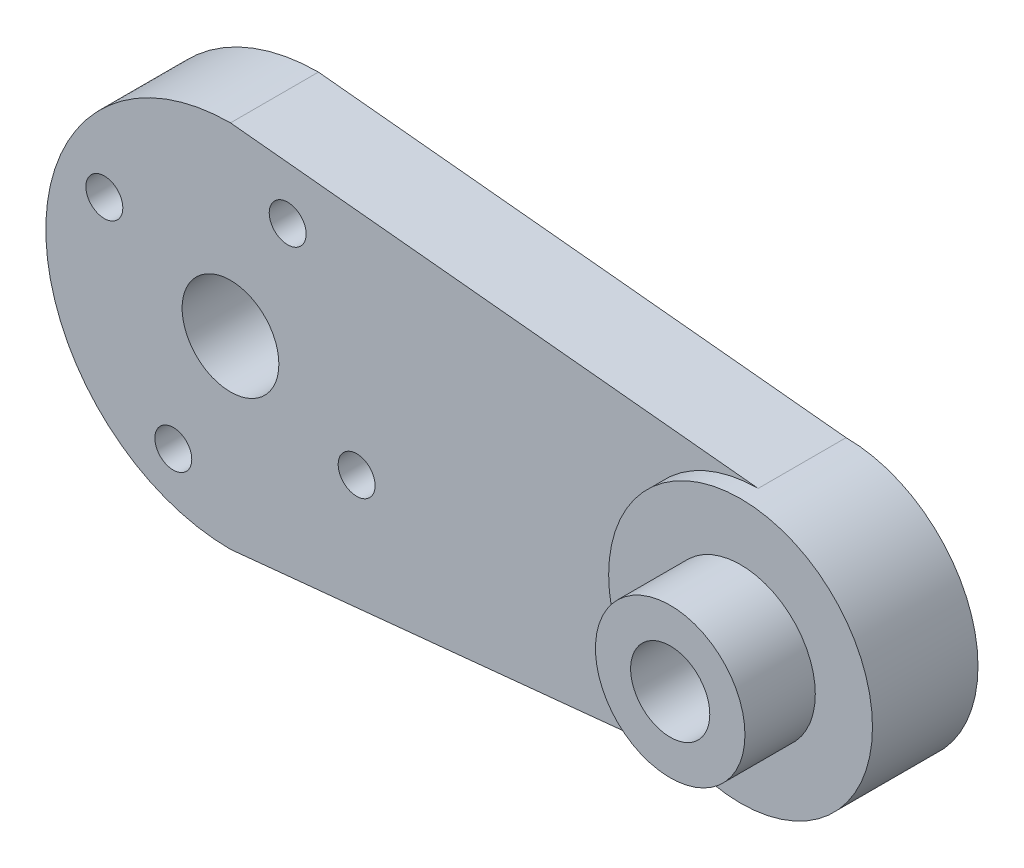
ISO-10303-21;
HEADER;
FILE_DESCRIPTION(('STEP AP214'),'2;1');
FILE_NAME('part.step','',(''),(''),'','','');
FILE_SCHEMA(('AUTOMOTIVE_DESIGN { 1 0 10303 214 1 1 1 1 }'));
ENDSEC;
DATA;
#1=APPLICATION_CONTEXT('core data for automotive mechanical design processes');
#2=APPLICATION_PROTOCOL_DEFINITION('international standard','automotive_design',2000,#1);
#3=PRODUCT_CONTEXT('',#1,'mechanical');
#4=PRODUCT('Part','Part','',(#3));
#5=PRODUCT_RELATED_PRODUCT_CATEGORY('part','',(#4));
#6=PRODUCT_DEFINITION_FORMATION('','',#4);
#7=PRODUCT_DEFINITION_CONTEXT('part definition',#1,'design');
#8=PRODUCT_DEFINITION('design','',#6,#7);
#9=PRODUCT_DEFINITION_SHAPE('','',#8);
#10=(LENGTH_UNIT() NAMED_UNIT(*) SI_UNIT(.MILLI.,.METRE.));
#11=(NAMED_UNIT(*) PLANE_ANGLE_UNIT() SI_UNIT($,.RADIAN.));
#12=(NAMED_UNIT(*) SI_UNIT($,.STERADIAN.) SOLID_ANGLE_UNIT());
#13=UNCERTAINTY_MEASURE_WITH_UNIT(LENGTH_MEASURE(1.E-05),#10,'distance_accuracy_value','');
#14=(GEOMETRIC_REPRESENTATION_CONTEXT(3) GLOBAL_UNCERTAINTY_ASSIGNED_CONTEXT((#13)) GLOBAL_UNIT_ASSIGNED_CONTEXT((#10,
#11,#12)) REPRESENTATION_CONTEXT('',''));
#15=CARTESIAN_POINT('',(0.,0.,0.));
#16=DIRECTION('',(0.,0.,1.));
#17=DIRECTION('',(1.,0.,0.));
#18=AXIS2_PLACEMENT_3D('',#15,#16,#17);
#19=CARTESIAN_POINT('',(0.,0.,5.));
#20=DIRECTION('',(0.,0.,1.));
#21=DIRECTION('',(1.,0.,0.));
#22=AXIS2_PLACEMENT_3D('',#19,#20,#21);
#23=PLANE('',#22);
#24=CARTESIAN_POINT('',(0.,0.,5.));
#25=DIRECTION('',(0.,0.,1.));
#26=DIRECTION('',(1.,0.,0.));
#27=AXIS2_PLACEMENT_3D('',#24,#25,#26);
#28=CIRCLE('',#27,2.75);
#29=CARTESIAN_POINT('',(2.75,0.,5.));
#30=VERTEX_POINT('',#29);
#31=EDGE_CURVE('E133',#30,#30,#28,.T.);
#32=ORIENTED_EDGE('',*,*,#31,.F.);
#33=EDGE_LOOP('',(#32));
#34=FACE_BOUND('',#33,.T.);
#35=CARTESIAN_POINT('',(3.25175455457334,7.17229177320174,5.));
#36=DIRECTION('',(0.,0.,1.));
#37=DIRECTION('',(1.,0.,0.));
#38=AXIS2_PLACEMENT_3D('',#35,#36,#37);
#39=CIRCLE('',#38,1.05);
#40=CARTESIAN_POINT('',(4.30175455457334,7.17229177320174,5.));
#41=VERTEX_POINT('',#40);
#42=EDGE_CURVE('E120',#41,#41,#39,.T.);
#43=ORIENTED_EDGE('',*,*,#42,.F.);
#44=EDGE_LOOP('',(#43));
#45=FACE_BOUND('',#44,.T.);
#46=CARTESIAN_POINT('',(-7.17229177428383,3.25175455441882,5.));
#47=DIRECTION('',(0.,0.,1.));
#48=DIRECTION('',(1.,0.,0.));
#49=AXIS2_PLACEMENT_3D('',#46,#47,#48);
#50=CIRCLE('',#49,1.05);
#51=CARTESIAN_POINT('',(-6.12229177428383,3.25175455441882,5.));
#52=VERTEX_POINT('',#51);
#53=EDGE_CURVE('E114',#52,#52,#50,.T.);
#54=ORIENTED_EDGE('',*,*,#53,.F.);
#55=EDGE_LOOP('',(#54));
#56=FACE_BOUND('',#55,.T.);
#57=CARTESIAN_POINT('',(-3.25175455550097,-7.17229177443826,5.));
#58=DIRECTION('',(0.,0.,1.));
#59=DIRECTION('',(1.,0.,0.));
#60=AXIS2_PLACEMENT_3D('',#57,#58,#59);
#61=CIRCLE('',#60,1.05);
#62=CARTESIAN_POINT('',(-2.20175455550097,-7.17229177443826,5.));
#63=VERTEX_POINT('',#62);
#64=EDGE_CURVE('E108',#63,#63,#61,.T.);
#65=ORIENTED_EDGE('',*,*,#64,.F.);
#66=EDGE_LOOP('',(#65));
#67=FACE_BOUND('',#66,.T.);
#68=CARTESIAN_POINT('',(7.17229177335619,-3.25175455565539,5.));
#69=DIRECTION('',(0.,0.,1.));
#70=DIRECTION('',(1.,0.,0.));
#71=AXIS2_PLACEMENT_3D('',#68,#69,#70);
#72=CIRCLE('',#71,1.05);
#73=CARTESIAN_POINT('',(8.22229177335619,-3.25175455565539,5.));
#74=VERTEX_POINT('',#73);
#75=EDGE_CURVE('E102',#74,#74,#72,.T.);
#76=ORIENTED_EDGE('',*,*,#75,.F.);
#77=EDGE_LOOP('',(#76));
#78=FACE_BOUND('',#77,.T.);
#79=DIRECTION('',(0.995037190209989,0.099503719020999,0.));
#80=VECTOR('',#79,1.);
#81=CARTESIAN_POINT('',(30.,-7.5,5.));
#82=LINE('',#81,#80);
#83=CARTESIAN_POINT('',(0.,-10.5,5.));
#84=VERTEX_POINT('',#83);
#85=CARTESIAN_POINT('',(30.,-7.5,5.));
#86=VERTEX_POINT('',#85);
#87=EDGE_CURVE('E79',#84,#86,#82,.T.);
#88=ORIENTED_EDGE('',*,*,#87,.T.);
#89=CARTESIAN_POINT('',(30.0000000001623,3.1863400806742E-11,5.));
#90=DIRECTION('',(0.,0.,1.));
#91=DIRECTION('',(1.,0.,0.));
#92=AXIS2_PLACEMENT_3D('',#89,#90,#91);
#93=CIRCLE('',#92,7.49999999983578);
#94=CARTESIAN_POINT('',(30.,7.49999999986765,5.));
#95=VERTEX_POINT('',#94);
#96=EDGE_CURVE('E89',#95,#86,#93,.T.);
#97=ORIENTED_EDGE('',*,*,#96,.F.);
#98=DIRECTION('',(-0.995037190209989,0.099503719020999,0.));
#99=VECTOR('',#98,1.);
#100=CARTESIAN_POINT('',(0.,10.5,5.));
#101=LINE('',#100,#99);
#102=CARTESIAN_POINT('',(0.,10.5,5.));
#103=VERTEX_POINT('',#102);
#104=EDGE_CURVE('E50',#95,#103,#101,.T.);
#105=ORIENTED_EDGE('',*,*,#104,.T.);
#106=CARTESIAN_POINT('',(0.,0.,5.));
#107=DIRECTION('',(0.,0.,1.));
#108=DIRECTION('',(1.,0.,0.));
#109=AXIS2_PLACEMENT_3D('',#106,#107,#108);
#110=CIRCLE('',#109,10.5);
#111=EDGE_CURVE('E139',#103,#84,#110,.T.);
#112=ORIENTED_EDGE('',*,*,#111,.T.);
#113=EDGE_LOOP('',(#88,#97,#105,#112));
#114=FACE_BOUND('',#113,.T.);
#115=ADVANCED_FACE('F33',(#34,#45,#56,#67,#78,#114),#23,.T.);
#116=CARTESIAN_POINT('',(0.,0.,0.));
#117=DIRECTION('',(0.,0.,1.));
#118=DIRECTION('',(1.,0.,0.));
#119=AXIS2_PLACEMENT_3D('',#116,#117,#118);
#120=PLANE('',#119);
#121=CARTESIAN_POINT('',(30.,0.,0.));
#122=DIRECTION('',(0.,0.,1.));
#123=DIRECTION('',(1.,0.,0.));
#124=AXIS2_PLACEMENT_3D('',#121,#122,#123);
#125=CIRCLE('',#124,2.25);
#126=CARTESIAN_POINT('',(32.25,0.,0.));
#127=VERTEX_POINT('',#126);
#128=EDGE_CURVE('E126',#127,#127,#125,.T.);
#129=ORIENTED_EDGE('',*,*,#128,.T.);
#130=EDGE_LOOP('',(#129));
#131=FACE_BOUND('',#130,.T.);
#132=CARTESIAN_POINT('',(0.,0.,0.));
#133=DIRECTION('',(0.,0.,1.));
#134=DIRECTION('',(1.,0.,0.));
#135=AXIS2_PLACEMENT_3D('',#132,#133,#134);
#136=CIRCLE('',#135,10.5);
#137=CARTESIAN_POINT('',(0.,10.5,0.));
#138=VERTEX_POINT('',#137);
#139=CARTESIAN_POINT('',(0.,-10.5,0.));
#140=VERTEX_POINT('',#139);
#141=EDGE_CURVE('E136',#138,#140,#136,.T.);
#142=ORIENTED_EDGE('',*,*,#141,.F.);
#143=DIRECTION('',(-0.995037190209989,0.099503719020999,0.));
#144=VECTOR('',#143,1.);
#145=CARTESIAN_POINT('',(0.,10.5,0.));
#146=LINE('',#145,#144);
#147=CARTESIAN_POINT('',(30.,7.5,0.));
#148=VERTEX_POINT('',#147);
#149=EDGE_CURVE('E74',#148,#138,#146,.T.);
#150=ORIENTED_EDGE('',*,*,#149,.F.);
#151=CARTESIAN_POINT('',(30.,0.,0.));
#152=DIRECTION('',(0.,0.,1.));
#153=DIRECTION('',(1.,0.,0.));
#154=AXIS2_PLACEMENT_3D('',#151,#152,#153);
#155=CIRCLE('',#154,7.5);
#156=CARTESIAN_POINT('',(30.,-7.5,0.));
#157=VERTEX_POINT('',#156);
#158=EDGE_CURVE('E69',#157,#148,#155,.T.);
#159=ORIENTED_EDGE('',*,*,#158,.F.);
#160=DIRECTION('',(0.995037190209989,0.099503719020999,0.));
#161=VECTOR('',#160,1.);
#162=CARTESIAN_POINT('',(30.,-7.5,0.));
#163=LINE('',#162,#161);
#164=EDGE_CURVE('E144',#140,#157,#163,.T.);
#165=ORIENTED_EDGE('',*,*,#164,.F.);
#166=EDGE_LOOP('',(#142,#150,#159,#165));
#167=FACE_BOUND('',#166,.T.);
#168=CARTESIAN_POINT('',(0.,0.,0.));
#169=DIRECTION('',(0.,0.,1.));
#170=DIRECTION('',(1.,0.,0.));
#171=AXIS2_PLACEMENT_3D('',#168,#169,#170);
#172=CIRCLE('',#171,2.75);
#173=CARTESIAN_POINT('',(2.75,0.,0.));
#174=VERTEX_POINT('',#173);
#175=EDGE_CURVE('E132',#174,#174,#172,.T.);
#176=ORIENTED_EDGE('',*,*,#175,.T.);
#177=EDGE_LOOP('',(#176));
#178=FACE_BOUND('',#177,.T.);
#179=CARTESIAN_POINT('',(3.25175455457334,7.17229177320174,0.));
#180=DIRECTION('',(0.,0.,-1.));
#181=DIRECTION('',(-1.,0.,0.));
#182=AXIS2_PLACEMENT_3D('',#179,#180,#181);
#183=CIRCLE('',#182,1.05);
#184=CARTESIAN_POINT('',(2.20175455457334,7.17229177320174,0.));
#185=VERTEX_POINT('',#184);
#186=EDGE_CURVE('E117',#185,#185,#183,.T.);
#187=ORIENTED_EDGE('',*,*,#186,.F.);
#188=EDGE_LOOP('',(#187));
#189=FACE_BOUND('',#188,.T.);
#190=CARTESIAN_POINT('',(-7.17229177428383,3.25175455441882,0.));
#191=DIRECTION('',(0.,0.,-1.));
#192=DIRECTION('',(-1.,0.,0.));
#193=AXIS2_PLACEMENT_3D('',#190,#191,#192);
#194=CIRCLE('',#193,1.05);
#195=CARTESIAN_POINT('',(-8.22229177428383,3.25175455441882,0.));
#196=VERTEX_POINT('',#195);
#197=EDGE_CURVE('E111',#196,#196,#194,.T.);
#198=ORIENTED_EDGE('',*,*,#197,.F.);
#199=EDGE_LOOP('',(#198));
#200=FACE_BOUND('',#199,.T.);
#201=CARTESIAN_POINT('',(-3.25175455550097,-7.17229177443826,0.));
#202=DIRECTION('',(0.,0.,-1.));
#203=DIRECTION('',(-1.,0.,0.));
#204=AXIS2_PLACEMENT_3D('',#201,#202,#203);
#205=CIRCLE('',#204,1.05);
#206=CARTESIAN_POINT('',(-4.30175455550097,-7.17229177443826,0.));
#207=VERTEX_POINT('',#206);
#208=EDGE_CURVE('E105',#207,#207,#205,.T.);
#209=ORIENTED_EDGE('',*,*,#208,.F.);
#210=EDGE_LOOP('',(#209));
#211=FACE_BOUND('',#210,.T.);
#212=CARTESIAN_POINT('',(7.17229177335619,-3.25175455565539,0.));
#213=DIRECTION('',(0.,0.,-1.));
#214=DIRECTION('',(-1.,0.,0.));
#215=AXIS2_PLACEMENT_3D('',#212,#213,#214);
#216=CIRCLE('',#215,1.05);
#217=CARTESIAN_POINT('',(6.12229177335619,-3.25175455565539,0.));
#218=VERTEX_POINT('',#217);
#219=EDGE_CURVE('E99',#218,#218,#216,.T.);
#220=ORIENTED_EDGE('',*,*,#219,.F.);
#221=EDGE_LOOP('',(#220));
#222=FACE_BOUND('',#221,.T.);
#223=ADVANCED_FACE('F150',(#131,#167,#178,#189,#200,#211,#222),#120,.F.);
#224=CARTESIAN_POINT('',(0.,0.,5.));
#225=DIRECTION('',(0.,0.,-1.));
#226=DIRECTION('',(-1.,0.,0.));
#227=AXIS2_PLACEMENT_3D('',#224,#225,#226);
#228=CYLINDRICAL_SURFACE('',#227,10.5);
#229=ORIENTED_EDGE('',*,*,#141,.T.);
#230=DIRECTION('',(0.,0.,-1.));
#231=VECTOR('',#230,1.);
#232=CARTESIAN_POINT('',(0.,-10.5,5.));
#233=LINE('',#232,#231);
#234=EDGE_CURVE('E11',#84,#140,#233,.T.);
#235=ORIENTED_EDGE('',*,*,#234,.F.);
#236=ORIENTED_EDGE('',*,*,#111,.F.);
#237=DIRECTION('',(0.,0.,-1.));
#238=VECTOR('',#237,1.);
#239=CARTESIAN_POINT('',(0.,10.5,5.));
#240=LINE('',#239,#238);
#241=EDGE_CURVE('E83',#103,#138,#240,.T.);
#242=ORIENTED_EDGE('',*,*,#241,.T.);
#243=EDGE_LOOP('',(#229,#235,#236,#242));
#244=FACE_BOUND('',#243,.T.);
#245=ADVANCED_FACE('F35',(#244),#228,.T.);
#246=CARTESIAN_POINT('',(30.,-7.5,5.));
#247=DIRECTION('',(-0.099503719020999,0.995037190209989,0.));
#248=DIRECTION('',(-0.995037190209989,-0.099503719020999,0.));
#249=AXIS2_PLACEMENT_3D('',#246,#247,#248);
#250=PLANE('',#249);
#251=ORIENTED_EDGE('',*,*,#164,.T.);
#252=DIRECTION('',(0.,0.,-1.));
#253=VECTOR('',#252,1.);
#254=CARTESIAN_POINT('',(30.,-7.5,5.));
#255=LINE('',#254,#253);
#256=EDGE_CURVE('E42',#86,#157,#255,.T.);
#257=ORIENTED_EDGE('',*,*,#256,.F.);
#258=ORIENTED_EDGE('',*,*,#87,.F.);
#259=ORIENTED_EDGE('',*,*,#234,.T.);
#260=EDGE_LOOP('',(#251,#257,#258,#259));
#261=FACE_BOUND('',#260,.T.);
#262=ADVANCED_FACE('F154',(#261),#250,.F.);
#263=CARTESIAN_POINT('',(30.,0.,5.));
#264=DIRECTION('',(0.,0.,-1.));
#265=DIRECTION('',(-1.,0.,0.));
#266=AXIS2_PLACEMENT_3D('',#263,#264,#265);
#267=CYLINDRICAL_SURFACE('',#266,7.5);
#268=ORIENTED_EDGE('',*,*,#158,.T.);
#269=DIRECTION('',(0.,0.,-1.));
#270=VECTOR('',#269,1.);
#271=CARTESIAN_POINT('',(30.,7.5,5.));
#272=LINE('',#271,#270);
#273=EDGE_CURVE('E82',#95,#148,#272,.T.);
#274=ORIENTED_EDGE('',*,*,#273,.F.);
#275=ORIENTED_EDGE('',*,*,#96,.T.);
#276=ORIENTED_EDGE('',*,*,#256,.T.);
#277=EDGE_LOOP('',(#268,#274,#275,#276));
#278=FACE_BOUND('',#277,.T.);
#279=CARTESIAN_POINT('',(30.0000000001623,3.1863400806742E-11,6.));
#280=DIRECTION('',(0.,0.,1.));
#281=DIRECTION('',(1.,0.,0.));
#282=AXIS2_PLACEMENT_3D('',#279,#280,#281);
#283=CIRCLE('',#282,7.49999999983578);
#284=CARTESIAN_POINT('',(37.4999999999981,3.1863400806742E-11,6.));
#285=VERTEX_POINT('',#284);
#286=EDGE_CURVE('E91',#285,#285,#283,.T.);
#287=ORIENTED_EDGE('',*,*,#286,.F.);
#288=EDGE_LOOP('',(#287));
#289=FACE_BOUND('',#288,.T.);
#290=ADVANCED_FACE('F87',(#278,#289),#267,.T.);
#291=CARTESIAN_POINT('',(0.,10.5,5.));
#292=DIRECTION('',(-0.099503719020999,-0.995037190209989,0.));
#293=DIRECTION('',(0.995037190209989,-0.099503719020999,0.));
#294=AXIS2_PLACEMENT_3D('',#291,#292,#293);
#295=PLANE('',#294);
#296=ORIENTED_EDGE('',*,*,#149,.T.);
#297=ORIENTED_EDGE('',*,*,#241,.F.);
#298=ORIENTED_EDGE('',*,*,#104,.F.);
#299=ORIENTED_EDGE('',*,*,#273,.T.);
#300=EDGE_LOOP('',(#296,#297,#298,#299));
#301=FACE_BOUND('',#300,.T.);
#302=ADVANCED_FACE('F81',(#301),#295,.F.);
#303=CARTESIAN_POINT('',(0.,0.,5.));
#304=DIRECTION('',(0.,0.,-1.));
#305=DIRECTION('',(-1.,0.,0.));
#306=AXIS2_PLACEMENT_3D('',#303,#304,#305);
#307=CYLINDRICAL_SURFACE('',#306,2.75);
#308=ORIENTED_EDGE('',*,*,#31,.T.);
#309=EDGE_LOOP('',(#308));
#310=FACE_BOUND('',#309,.T.);
#311=ORIENTED_EDGE('',*,*,#175,.F.);
#312=EDGE_LOOP('',(#311));
#313=FACE_BOUND('',#312,.T.);
#314=ADVANCED_FACE('F172',(#310,#313),#307,.F.);
#315=CARTESIAN_POINT('',(30.,0.,10.));
#316=DIRECTION('',(0.,0.,-1.));
#317=DIRECTION('',(-1.,0.,0.));
#318=AXIS2_PLACEMENT_3D('',#315,#316,#317);
#319=CYLINDRICAL_SURFACE('',#318,4.25000000000001);
#320=CARTESIAN_POINT('',(30.,0.,6.));
#321=DIRECTION('',(0.,0.,1.));
#322=DIRECTION('',(1.,0.,0.));
#323=AXIS2_PLACEMENT_3D('',#320,#321,#322);
#324=CIRCLE('',#323,4.25000000000001);
#325=CARTESIAN_POINT('',(34.25,0.,6.));
#326=VERTEX_POINT('',#325);
#327=EDGE_CURVE('E94',#326,#326,#324,.T.);
#328=ORIENTED_EDGE('',*,*,#327,.T.);
#329=EDGE_LOOP('',(#328));
#330=FACE_BOUND('',#329,.T.);
#331=CARTESIAN_POINT('',(30.,0.,10.));
#332=DIRECTION('',(0.,0.,1.));
#333=DIRECTION('',(1.,0.,0.));
#334=AXIS2_PLACEMENT_3D('',#331,#332,#333);
#335=CIRCLE('',#334,4.25000000000001);
#336=CARTESIAN_POINT('',(34.25,0.,10.));
#337=VERTEX_POINT('',#336);
#338=EDGE_CURVE('E129',#337,#337,#335,.T.);
#339=ORIENTED_EDGE('',*,*,#338,.F.);
#340=EDGE_LOOP('',(#339));
#341=FACE_BOUND('',#340,.T.);
#342=ADVANCED_FACE('F179',(#330,#341),#319,.T.);
#343=CARTESIAN_POINT('',(30.,0.,10.));
#344=DIRECTION('',(0.,0.,1.));
#345=DIRECTION('',(1.,0.,0.));
#346=AXIS2_PLACEMENT_3D('',#343,#344,#345);
#347=PLANE('',#346);
#348=CARTESIAN_POINT('',(30.,0.,10.));
#349=DIRECTION('',(0.,0.,1.));
#350=DIRECTION('',(1.,0.,0.));
#351=AXIS2_PLACEMENT_3D('',#348,#349,#350);
#352=CIRCLE('',#351,2.25);
#353=CARTESIAN_POINT('',(32.25,0.,10.));
#354=VERTEX_POINT('',#353);
#355=EDGE_CURVE('E123',#354,#354,#352,.T.);
#356=ORIENTED_EDGE('',*,*,#355,.F.);
#357=EDGE_LOOP('',(#356));
#358=FACE_BOUND('',#357,.T.);
#359=ORIENTED_EDGE('',*,*,#338,.T.);
#360=EDGE_LOOP('',(#359));
#361=FACE_BOUND('',#360,.T.);
#362=ADVANCED_FACE('F184',(#358,#361),#347,.T.);
#363=CARTESIAN_POINT('',(30.,0.,-30.));
#364=DIRECTION('',(0.,0.,1.));
#365=DIRECTION('',(1.,0.,0.));
#366=AXIS2_PLACEMENT_3D('',#363,#364,#365);
#367=CYLINDRICAL_SURFACE('',#366,2.25);
#368=ORIENTED_EDGE('',*,*,#355,.T.);
#369=EDGE_LOOP('',(#368));
#370=FACE_BOUND('',#369,.T.);
#371=ORIENTED_EDGE('',*,*,#128,.F.);
#372=EDGE_LOOP('',(#371));
#373=FACE_BOUND('',#372,.T.);
#374=ADVANCED_FACE('F221',(#370,#373),#367,.F.);
#375=CARTESIAN_POINT('',(3.25175455457334,7.17229177320174,0.));
#376=DIRECTION('',(0.,0.,-1.));
#377=DIRECTION('',(-1.,0.,0.));
#378=AXIS2_PLACEMENT_3D('',#375,#376,#377);
#379=CYLINDRICAL_SURFACE('',#378,1.05);
#380=ORIENTED_EDGE('',*,*,#186,.T.);
#381=EDGE_LOOP('',(#380));
#382=FACE_BOUND('',#381,.T.);
#383=ORIENTED_EDGE('',*,*,#42,.T.);
#384=EDGE_LOOP('',(#383));
#385=FACE_BOUND('',#384,.T.);
#386=ADVANCED_FACE('F217',(#382,#385),#379,.F.);
#387=CARTESIAN_POINT('',(-7.17229177428383,3.25175455441882,0.));
#388=DIRECTION('',(0.,0.,-1.));
#389=DIRECTION('',(-1.,0.,0.));
#390=AXIS2_PLACEMENT_3D('',#387,#388,#389);
#391=CYLINDRICAL_SURFACE('',#390,1.05);
#392=ORIENTED_EDGE('',*,*,#197,.T.);
#393=EDGE_LOOP('',(#392));
#394=FACE_BOUND('',#393,.T.);
#395=ORIENTED_EDGE('',*,*,#53,.T.);
#396=EDGE_LOOP('',(#395));
#397=FACE_BOUND('',#396,.T.);
#398=ADVANCED_FACE('F211',(#394,#397),#391,.F.);
#399=CARTESIAN_POINT('',(-3.25175455550097,-7.17229177443826,0.));
#400=DIRECTION('',(0.,0.,-1.));
#401=DIRECTION('',(-1.,0.,0.));
#402=AXIS2_PLACEMENT_3D('',#399,#400,#401);
#403=CYLINDRICAL_SURFACE('',#402,1.05);
#404=ORIENTED_EDGE('',*,*,#208,.T.);
#405=EDGE_LOOP('',(#404));
#406=FACE_BOUND('',#405,.T.);
#407=ORIENTED_EDGE('',*,*,#64,.T.);
#408=EDGE_LOOP('',(#407));
#409=FACE_BOUND('',#408,.T.);
#410=ADVANCED_FACE('F201',(#406,#409),#403,.F.);
#411=CARTESIAN_POINT('',(7.17229177335619,-3.25175455565539,0.));
#412=DIRECTION('',(0.,0.,-1.));
#413=DIRECTION('',(-1.,0.,0.));
#414=AXIS2_PLACEMENT_3D('',#411,#412,#413);
#415=CYLINDRICAL_SURFACE('',#414,1.05);
#416=ORIENTED_EDGE('',*,*,#219,.T.);
#417=EDGE_LOOP('',(#416));
#418=FACE_BOUND('',#417,.T.);
#419=ORIENTED_EDGE('',*,*,#75,.T.);
#420=EDGE_LOOP('',(#419));
#421=FACE_BOUND('',#420,.T.);
#422=ADVANCED_FACE('F197',(#418,#421),#415,.F.);
#423=CARTESIAN_POINT('',(30.0000000001623,3.1863400806742E-11,6.));
#424=DIRECTION('',(0.,0.,1.));
#425=DIRECTION('',(1.,0.,0.));
#426=AXIS2_PLACEMENT_3D('',#423,#424,#425);
#427=PLANE('',#426);
#428=ORIENTED_EDGE('',*,*,#286,.T.);
#429=EDGE_LOOP('',(#428));
#430=FACE_BOUND('',#429,.T.);
#431=ORIENTED_EDGE('',*,*,#327,.F.);
#432=EDGE_LOOP('',(#431));
#433=FACE_BOUND('',#432,.T.);
#434=ADVANCED_FACE('F200',(#430,#433),#427,.T.);
#435=CLOSED_SHELL('',(#115,#223,#245,#262,#290,#302,#314,#342,#362,#374,#386,#398,#410,#422,#434));
#436=MANIFOLD_SOLID_BREP('B2',#435);
#437=ADVANCED_BREP_SHAPE_REPRESENTATION('',(#18,#436),#14);
#438=SHAPE_DEFINITION_REPRESENTATION(#9,#437);
ENDSEC;
END-ISO-10303-21;
